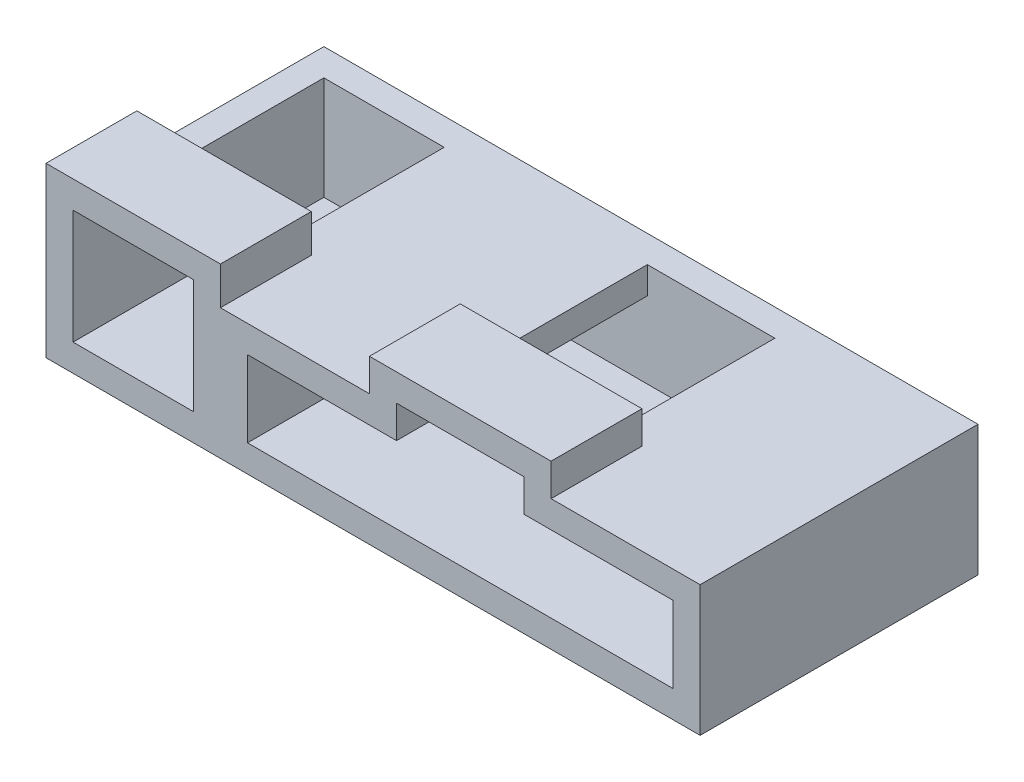
ISO-10303-21;
HEADER;
FILE_DESCRIPTION(('STEP AP214'),'2;1');
FILE_NAME('part.step','',(''),(''),'','','');
FILE_SCHEMA(('AUTOMOTIVE_DESIGN { 1 0 10303 214 1 1 1 1 }'));
ENDSEC;
DATA;
#1=APPLICATION_CONTEXT('core data for automotive mechanical design processes');
#2=APPLICATION_PROTOCOL_DEFINITION('international standard','automotive_design',2000,#1);
#3=PRODUCT_CONTEXT('',#1,'mechanical');
#4=PRODUCT('Part','Part','',(#3));
#5=PRODUCT_RELATED_PRODUCT_CATEGORY('part','',(#4));
#6=PRODUCT_DEFINITION_FORMATION('','',#4);
#7=PRODUCT_DEFINITION_CONTEXT('part definition',#1,'design');
#8=PRODUCT_DEFINITION('design','',#6,#7);
#9=PRODUCT_DEFINITION_SHAPE('','',#8);
#10=(LENGTH_UNIT() NAMED_UNIT(*) SI_UNIT(.MILLI.,.METRE.));
#11=(NAMED_UNIT(*) PLANE_ANGLE_UNIT() SI_UNIT($,.RADIAN.));
#12=(NAMED_UNIT(*) SI_UNIT($,.STERADIAN.) SOLID_ANGLE_UNIT());
#13=UNCERTAINTY_MEASURE_WITH_UNIT(LENGTH_MEASURE(1.E-05),#10,'distance_accuracy_value','');
#14=(GEOMETRIC_REPRESENTATION_CONTEXT(3) GLOBAL_UNCERTAINTY_ASSIGNED_CONTEXT((#13)) GLOBAL_UNIT_ASSIGNED_CONTEXT((#10,
#11,#12)) REPRESENTATION_CONTEXT('',''));
#15=CARTESIAN_POINT('',(0.,0.,0.));
#16=DIRECTION('',(0.,0.,1.));
#17=DIRECTION('',(1.,0.,0.));
#18=AXIS2_PLACEMENT_3D('',#15,#16,#17);
#19=CARTESIAN_POINT('',(-43.6494661724568,7.112,-32.0176029341922));
#20=DIRECTION('',(0.,0.,1.));
#21=DIRECTION('',(1.,0.,0.));
#22=AXIS2_PLACEMENT_3D('',#19,#20,#21);
#23=PLANE('',#22);
#24=DIRECTION('',(0.,-1.,0.));
#25=VECTOR('',#24,1.);
#26=CARTESIAN_POINT('',(-43.6494661724568,7.112,-32.0176029341922));
#27=LINE('',#26,#25);
#28=CARTESIAN_POINT('',(-43.6494661724568,5.5118,-32.0176029341922));
#29=VERTEX_POINT('',#28);
#30=CARTESIAN_POINT('',(-43.6494661724568,0.,-32.0176029341922));
#31=VERTEX_POINT('',#30);
#32=EDGE_CURVE('E241',#29,#31,#27,.T.);
#33=ORIENTED_EDGE('',*,*,#32,.F.);
#34=DIRECTION('',(-1.,0.,0.));
#35=VECTOR('',#34,1.);
#36=CARTESIAN_POINT('',(-43.6494661724568,5.5118,-32.0176029341922));
#37=LINE('',#36,#35);
#38=CARTESIAN_POINT('',(-16.0269661724568,5.5118,-32.0176029341922));
#39=VERTEX_POINT('',#38);
#40=EDGE_CURVE('E264',#39,#29,#37,.T.);
#41=ORIENTED_EDGE('',*,*,#40,.F.);
#42=DIRECTION('',(0.,-1.,0.));
#43=VECTOR('',#42,1.);
#44=CARTESIAN_POINT('',(-16.0269661724568,7.112,-32.0176029341922));
#45=LINE('',#44,#43);
#46=CARTESIAN_POINT('',(-16.0269661724568,0.,-32.0176029341922));
#47=VERTEX_POINT('',#46);
#48=EDGE_CURVE('E258',#39,#47,#45,.T.);
#49=ORIENTED_EDGE('',*,*,#48,.T.);
#50=DIRECTION('',(-1.,0.,0.));
#51=VECTOR('',#50,1.);
#52=CARTESIAN_POINT('',(-43.6494661724568,0.,-32.0176029341922));
#53=LINE('',#52,#51);
#54=EDGE_CURVE('E239',#47,#31,#53,.T.);
#55=ORIENTED_EDGE('',*,*,#54,.T.);
#56=EDGE_LOOP('',(#33,#41,#49,#55));
#57=FACE_BOUND('',#56,.T.);
#58=ADVANCED_FACE('F34',(#57),#23,.F.);
#59=CARTESIAN_POINT('',(-43.6494661724568,7.112,-30.8746029341922));
#60=DIRECTION('',(0.,0.,1.));
#61=DIRECTION('',(1.,0.,0.));
#62=AXIS2_PLACEMENT_3D('',#59,#60,#61);
#63=PLANE('',#62);
#64=DIRECTION('',(0.,-1.,0.));
#65=VECTOR('',#64,1.);
#66=CARTESIAN_POINT('',(-37.4264661724568,5.969,-30.8746029341922));
#67=LINE('',#66,#65);
#68=CARTESIAN_POINT('',(-37.4264661724568,5.5118,-30.8746029341922));
#69=VERTEX_POINT('',#68);
#70=CARTESIAN_POINT('',(-37.4264661724568,1.143,-30.8746029341922));
#71=VERTEX_POINT('',#70);
#72=EDGE_CURVE('E334',#69,#71,#67,.T.);
#73=ORIENTED_EDGE('',*,*,#72,.F.);
#74=DIRECTION('',(-1.,0.,0.));
#75=VECTOR('',#74,1.);
#76=CARTESIAN_POINT('',(-43.6494661724568,5.5118,-30.8746029341922));
#77=LINE('',#76,#75);
#78=CARTESIAN_POINT('',(-42.5064661724568,5.5118,-30.8746029341922));
#79=VERTEX_POINT('',#78);
#80=EDGE_CURVE('E436',#69,#79,#77,.T.);
#81=ORIENTED_EDGE('',*,*,#80,.T.);
#82=DIRECTION('',(0.,1.,0.));
#83=VECTOR('',#82,1.);
#84=CARTESIAN_POINT('',(-42.5064661724568,1.143,-30.8746029341922));
#85=LINE('',#84,#83);
#86=CARTESIAN_POINT('',(-42.5064661724568,1.143,-30.8746029341922));
#87=VERTEX_POINT('',#86);
#88=EDGE_CURVE('E336',#87,#79,#85,.T.);
#89=ORIENTED_EDGE('',*,*,#88,.F.);
#90=DIRECTION('',(-1.,0.,0.));
#91=VECTOR('',#90,1.);
#92=CARTESIAN_POINT('',(-37.4264661724568,1.143,-30.8746029341922));
#93=LINE('',#92,#91);
#94=EDGE_CURVE('E340',#71,#87,#93,.T.);
#95=ORIENTED_EDGE('',*,*,#94,.F.);
#96=EDGE_LOOP('',(#73,#81,#89,#95));
#97=FACE_BOUND('',#96,.T.);
#98=ADVANCED_FACE('F503',(#97),#63,.T.);
#99=CARTESIAN_POINT('',(-43.6494661724568,7.112,-30.8746029341922));
#100=DIRECTION('',(0.,0.,1.));
#101=DIRECTION('',(1.,0.,0.));
#102=AXIS2_PLACEMENT_3D('',#99,#100,#101);
#103=PLANE('',#102);
#104=DIRECTION('',(0.,-1.,0.));
#105=VECTOR('',#104,1.);
#106=CARTESIAN_POINT('',(-23.4628161724568,4.3688,-30.8746029341922));
#107=LINE('',#106,#105);
#108=CARTESIAN_POINT('',(-23.4628161724568,5.5118,-30.8746029341922));
#109=VERTEX_POINT('',#108);
#110=CARTESIAN_POINT('',(-23.4628161724568,4.3688,-30.8746029341922));
#111=VERTEX_POINT('',#110);
#112=EDGE_CURVE('E275',#109,#111,#107,.T.);
#113=ORIENTED_EDGE('',*,*,#112,.F.);
#114=DIRECTION('',(-1.,0.,0.));
#115=VECTOR('',#114,1.);
#116=CARTESIAN_POINT('',(-43.6494661724568,5.5118,-30.8746029341922));
#117=LINE('',#116,#115);
#118=CARTESIAN_POINT('',(-28.8476161724568,5.5118,-30.8746029341922));
#119=VERTEX_POINT('',#118);
#120=EDGE_CURVE('E42',#109,#119,#117,.T.);
#121=ORIENTED_EDGE('',*,*,#120,.T.);
#122=DIRECTION('',(0.,1.,0.));
#123=VECTOR('',#122,1.);
#124=CARTESIAN_POINT('',(-28.8476161724568,5.7404,-30.8746029341922));
#125=LINE('',#124,#123);
#126=CARTESIAN_POINT('',(-28.8476161724568,4.3688,-30.8746029341922));
#127=VERTEX_POINT('',#126);
#128=EDGE_CURVE('E272',#127,#119,#125,.T.);
#129=ORIENTED_EDGE('',*,*,#128,.F.);
#130=DIRECTION('',(1.,0.,0.));
#131=VECTOR('',#130,1.);
#132=CARTESIAN_POINT('',(-28.8476161724568,4.3688,-30.8746029341922));
#133=LINE('',#132,#131);
#134=CARTESIAN_POINT('',(-35.1404661724568,4.3688,-30.8746029341922));
#135=VERTEX_POINT('',#134);
#136=EDGE_CURVE('E284',#135,#127,#133,.T.);
#137=ORIENTED_EDGE('',*,*,#136,.F.);
#138=DIRECTION('',(0.,1.,0.));
#139=VECTOR('',#138,1.);
#140=CARTESIAN_POINT('',(-35.1404661724568,4.3688,-30.8746029341922));
#141=LINE('',#140,#139);
#142=CARTESIAN_POINT('',(-35.1404661724568,1.143,-30.8746029341922));
#143=VERTEX_POINT('',#142);
#144=EDGE_CURVE('E286',#143,#135,#141,.T.);
#145=ORIENTED_EDGE('',*,*,#144,.F.);
#146=DIRECTION('',(-1.,0.,0.));
#147=VECTOR('',#146,1.);
#148=CARTESIAN_POINT('',(-35.1404661724568,1.143,-30.8746029341922));
#149=LINE('',#148,#147);
#150=CARTESIAN_POINT('',(-17.1699661724568,1.143,-30.8746029341922));
#151=VERTEX_POINT('',#150);
#152=EDGE_CURVE('E317',#151,#143,#149,.T.);
#153=ORIENTED_EDGE('',*,*,#152,.F.);
#154=DIRECTION('',(0.,-1.,0.));
#155=VECTOR('',#154,1.);
#156=CARTESIAN_POINT('',(-17.1699661724568,1.143,-30.8746029341922));
#157=LINE('',#156,#155);
#158=CARTESIAN_POINT('',(-17.1699661724568,4.3688,-30.8746029341922));
#159=VERTEX_POINT('',#158);
#160=EDGE_CURVE('E410',#159,#151,#157,.T.);
#161=ORIENTED_EDGE('',*,*,#160,.F.);
#162=DIRECTION('',(1.,0.,0.));
#163=VECTOR('',#162,1.);
#164=CARTESIAN_POINT('',(-17.1699661724568,4.3688,-30.8746029341922));
#165=LINE('',#164,#163);
#166=EDGE_CURVE('E288',#111,#159,#165,.T.);
#167=ORIENTED_EDGE('',*,*,#166,.F.);
#168=EDGE_LOOP('',(#113,#121,#129,#137,#145,#153,#161,#167));
#169=FACE_BOUND('',#168,.T.);
#170=ADVANCED_FACE('F270',(#169),#103,.T.);
#171=CARTESIAN_POINT('',(-43.6494661724568,7.112,-20.2828029341922));
#172=DIRECTION('',(0.,0.,-1.));
#173=DIRECTION('',(-1.,0.,0.));
#174=AXIS2_PLACEMENT_3D('',#171,#172,#173);
#175=PLANE('',#174);
#176=DIRECTION('',(0.,-1.,0.));
#177=VECTOR('',#176,1.);
#178=CARTESIAN_POINT('',(-35.1404661724568,4.3688,-20.2828029341922));
#179=LINE('',#178,#177);
#180=CARTESIAN_POINT('',(-35.1404661724568,4.3688,-20.2828029341922));
#181=VERTEX_POINT('',#180);
#182=CARTESIAN_POINT('',(-35.1404661724568,1.143,-20.2828029341922));
#183=VERTEX_POINT('',#182);
#184=EDGE_CURVE('E294',#181,#183,#179,.T.);
#185=ORIENTED_EDGE('',*,*,#184,.F.);
#186=DIRECTION('',(-1.,0.,0.));
#187=VECTOR('',#186,1.);
#188=CARTESIAN_POINT('',(-28.8476161724568,4.3688,-20.2828029341922));
#189=LINE('',#188,#187);
#190=CARTESIAN_POINT('',(-28.8476161724568,4.3688,-20.2828029341922));
#191=VERTEX_POINT('',#190);
#192=EDGE_CURVE('E292',#191,#181,#189,.T.);
#193=ORIENTED_EDGE('',*,*,#192,.F.);
#194=DIRECTION('',(0.,-1.,0.));
#195=VECTOR('',#194,1.);
#196=CARTESIAN_POINT('',(-28.8476161724568,5.7404,-20.2828029341922));
#197=LINE('',#196,#195);
#198=CARTESIAN_POINT('',(-28.8476161724568,5.7404,-20.2828029341922));
#199=VERTEX_POINT('',#198);
#200=EDGE_CURVE('E313',#199,#191,#197,.T.);
#201=ORIENTED_EDGE('',*,*,#200,.F.);
#202=DIRECTION('',(-1.,0.,0.));
#203=VECTOR('',#202,1.);
#204=CARTESIAN_POINT('',(-23.4628161724568,5.7404,-20.2828029341922));
#205=LINE('',#204,#203);
#206=CARTESIAN_POINT('',(-23.4628161724568,5.7404,-20.2828029341922));
#207=VERTEX_POINT('',#206);
#208=EDGE_CURVE('E310',#207,#199,#205,.T.);
#209=ORIENTED_EDGE('',*,*,#208,.F.);
#210=DIRECTION('',(0.,1.,0.));
#211=VECTOR('',#210,1.);
#212=CARTESIAN_POINT('',(-23.4628161724568,4.3688,-20.2828029341922));
#213=LINE('',#212,#211);
#214=CARTESIAN_POINT('',(-23.4628161724568,4.3688,-20.2828029341922));
#215=VERTEX_POINT('',#214);
#216=EDGE_CURVE('E307',#215,#207,#213,.T.);
#217=ORIENTED_EDGE('',*,*,#216,.F.);
#218=DIRECTION('',(-1.,0.,0.));
#219=VECTOR('',#218,1.);
#220=CARTESIAN_POINT('',(-17.1699661724568,4.3688,-20.2828029341922));
#221=LINE('',#220,#219);
#222=CARTESIAN_POINT('',(-17.1699661724568,4.3688,-20.2828029341922));
#223=VERTEX_POINT('',#222);
#224=EDGE_CURVE('E304',#223,#215,#221,.T.);
#225=ORIENTED_EDGE('',*,*,#224,.F.);
#226=DIRECTION('',(0.,1.,0.));
#227=VECTOR('',#226,1.);
#228=CARTESIAN_POINT('',(-17.1699661724568,1.143,-20.2828029341922));
#229=LINE('',#228,#227);
#230=CARTESIAN_POINT('',(-17.1699661724568,1.143,-20.2828029341922));
#231=VERTEX_POINT('',#230);
#232=EDGE_CURVE('E301',#231,#223,#229,.T.);
#233=ORIENTED_EDGE('',*,*,#232,.F.);
#234=DIRECTION('',(1.,0.,0.));
#235=VECTOR('',#234,1.);
#236=CARTESIAN_POINT('',(-35.1404661724568,1.143,-20.2828029341922));
#237=LINE('',#236,#235);
#238=EDGE_CURVE('E298',#183,#231,#237,.T.);
#239=ORIENTED_EDGE('',*,*,#238,.F.);
#240=EDGE_LOOP('',(#185,#193,#201,#209,#217,#225,#233,#239));
#241=FACE_BOUND('',#240,.T.);
#242=DIRECTION('',(1.,0.,0.));
#243=VECTOR('',#242,1.);
#244=CARTESIAN_POINT('',(-37.4264661724568,1.143,-20.2828029341922));
#245=LINE('',#244,#243);
#246=CARTESIAN_POINT('',(-42.5064661724568,1.143,-20.2828029341922));
#247=VERTEX_POINT('',#246);
#248=CARTESIAN_POINT('',(-37.4264661724568,1.143,-20.2828029341922));
#249=VERTEX_POINT('',#248);
#250=EDGE_CURVE('E342',#247,#249,#245,.T.);
#251=ORIENTED_EDGE('',*,*,#250,.F.);
#252=DIRECTION('',(0.,-1.,0.));
#253=VECTOR('',#252,1.);
#254=CARTESIAN_POINT('',(-42.5064661724568,1.143,-20.2828029341922));
#255=LINE('',#254,#253);
#256=CARTESIAN_POINT('',(-42.5064661724568,5.969,-20.2828029341922));
#257=VERTEX_POINT('',#256);
#258=EDGE_CURVE('E333',#257,#247,#255,.T.);
#259=ORIENTED_EDGE('',*,*,#258,.F.);
#260=DIRECTION('',(-1.,0.,0.));
#261=VECTOR('',#260,1.);
#262=CARTESIAN_POINT('',(-42.5064661724568,5.969,-20.2828029341922));
#263=LINE('',#262,#261);
#264=CARTESIAN_POINT('',(-37.4264661724568,5.969,-20.2828029341922));
#265=VERTEX_POINT('',#264);
#266=EDGE_CURVE('E348',#265,#257,#263,.T.);
#267=ORIENTED_EDGE('',*,*,#266,.F.);
#268=DIRECTION('',(0.,1.,0.));
#269=VECTOR('',#268,1.);
#270=CARTESIAN_POINT('',(-37.4264661724568,5.969,-20.2828029341922));
#271=LINE('',#270,#269);
#272=EDGE_CURVE('E345',#249,#265,#271,.T.);
#273=ORIENTED_EDGE('',*,*,#272,.F.);
#274=EDGE_LOOP('',(#251,#259,#267,#273));
#275=FACE_BOUND('',#274,.T.);
#276=DIRECTION('',(0.,-1.,0.));
#277=VECTOR('',#276,1.);
#278=CARTESIAN_POINT('',(-36.2834661724568,7.112,-20.2828029341922));
#279=LINE('',#278,#277);
#280=CARTESIAN_POINT('',(-36.2834661724568,7.112,-20.2828029341922));
#281=VERTEX_POINT('',#280);
#282=CARTESIAN_POINT('',(-36.2834661724568,5.5118,-20.2828029341922));
#283=VERTEX_POINT('',#282);
#284=EDGE_CURVE('E378',#281,#283,#279,.T.);
#285=ORIENTED_EDGE('',*,*,#284,.F.);
#286=DIRECTION('',(1.,0.,0.));
#287=VECTOR('',#286,1.);
#288=CARTESIAN_POINT('',(-43.6494661724568,7.112,-20.2828029341922));
#289=LINE('',#288,#287);
#290=CARTESIAN_POINT('',(-43.6494661724568,7.112,-20.2828029341922));
#291=VERTEX_POINT('',#290);
#292=EDGE_CURVE('E238',#291,#281,#289,.T.);
#293=ORIENTED_EDGE('',*,*,#292,.F.);
#294=DIRECTION('',(0.,-1.,0.));
#295=VECTOR('',#294,1.);
#296=CARTESIAN_POINT('',(-43.6494661724568,7.112,-20.2828029341922));
#297=LINE('',#296,#295);
#298=CARTESIAN_POINT('',(-43.6494661724568,0.,-20.2828029341922));
#299=VERTEX_POINT('',#298);
#300=EDGE_CURVE('E237',#291,#299,#297,.T.);
#301=ORIENTED_EDGE('',*,*,#300,.T.);
#302=DIRECTION('',(1.,0.,0.));
#303=VECTOR('',#302,1.);
#304=CARTESIAN_POINT('',(-43.6494661724568,0.,-20.2828029341922));
#305=LINE('',#304,#303);
#306=CARTESIAN_POINT('',(-16.0269661724568,0.,-20.2828029341922));
#307=VERTEX_POINT('',#306);
#308=EDGE_CURVE('E252',#299,#307,#305,.T.);
#309=ORIENTED_EDGE('',*,*,#308,.T.);
#310=DIRECTION('',(0.,-1.,0.));
#311=VECTOR('',#310,1.);
#312=CARTESIAN_POINT('',(-16.0269661724568,7.112,-20.2828029341922));
#313=LINE('',#312,#311);
#314=CARTESIAN_POINT('',(-16.0269661724568,5.5118,-20.2828029341922));
#315=VERTEX_POINT('',#314);
#316=EDGE_CURVE('E260',#315,#307,#313,.T.);
#317=ORIENTED_EDGE('',*,*,#316,.F.);
#318=DIRECTION('',(1.,0.,0.));
#319=VECTOR('',#318,1.);
#320=CARTESIAN_POINT('',(-43.6494661724568,5.5118,-20.2828029341922));
#321=LINE('',#320,#319);
#322=CARTESIAN_POINT('',(-22.3198161724568,5.5118,-20.2828029341922));
#323=VERTEX_POINT('',#322);
#324=EDGE_CURVE('E381',#323,#315,#321,.T.);
#325=ORIENTED_EDGE('',*,*,#324,.F.);
#326=DIRECTION('',(0.,-1.,0.));
#327=VECTOR('',#326,1.);
#328=CARTESIAN_POINT('',(-22.3198161724568,7.112,-20.2828029341922));
#329=LINE('',#328,#327);
#330=CARTESIAN_POINT('',(-22.3198161724568,6.8834,-20.2828029341922));
#331=VERTEX_POINT('',#330);
#332=EDGE_CURVE('E384',#331,#323,#329,.T.);
#333=ORIENTED_EDGE('',*,*,#332,.F.);
#334=DIRECTION('',(1.,0.,0.));
#335=VECTOR('',#334,1.);
#336=CARTESIAN_POINT('',(-43.6494661724568,6.8834,-20.2828029341922));
#337=LINE('',#336,#335);
#338=CARTESIAN_POINT('',(-29.9906161724568,6.8834,-20.2828029341922));
#339=VERTEX_POINT('',#338);
#340=EDGE_CURVE('E387',#339,#331,#337,.T.);
#341=ORIENTED_EDGE('',*,*,#340,.F.);
#342=DIRECTION('',(0.,1.,0.));
#343=VECTOR('',#342,1.);
#344=CARTESIAN_POINT('',(-29.9906161724568,7.112,-20.2828029341922));
#345=LINE('',#344,#343);
#346=CARTESIAN_POINT('',(-29.9906161724568,5.5118,-20.2828029341922));
#347=VERTEX_POINT('',#346);
#348=EDGE_CURVE('E389',#347,#339,#345,.T.);
#349=ORIENTED_EDGE('',*,*,#348,.F.);
#350=DIRECTION('',(1.,0.,0.));
#351=VECTOR('',#350,1.);
#352=CARTESIAN_POINT('',(-43.6494661724568,5.5118,-20.2828029341922));
#353=LINE('',#352,#351);
#354=EDGE_CURVE('E247',#283,#347,#353,.T.);
#355=ORIENTED_EDGE('',*,*,#354,.F.);
#356=EDGE_LOOP('',(#285,#293,#301,#309,#317,#325,#333,#341,#349,#355));
#357=FACE_BOUND('',#356,.T.);
#358=ADVANCED_FACE('F427',(#241,#275,#357),#175,.F.);
#359=CARTESIAN_POINT('',(-16.0269661724568,7.112,-20.2828029341922));
#360=DIRECTION('',(-1.,0.,0.));
#361=DIRECTION('',(0.,0.,1.));
#362=AXIS2_PLACEMENT_3D('',#359,#360,#361);
#363=PLANE('',#362);
#364=DIRECTION('',(0.,0.,-1.));
#365=VECTOR('',#364,1.);
#366=CARTESIAN_POINT('',(-16.0269661724568,5.5118,18.2709051658806));
#367=LINE('',#366,#365);
#368=EDGE_CURVE('E361',#315,#39,#367,.T.);
#369=ORIENTED_EDGE('',*,*,#368,.F.);
#370=ORIENTED_EDGE('',*,*,#316,.T.);
#371=DIRECTION('',(0.,0.,-1.));
#372=VECTOR('',#371,1.);
#373=CARTESIAN_POINT('',(-16.0269661724568,0.,-20.2828029341922));
#374=LINE('',#373,#372);
#375=EDGE_CURVE('E244',#307,#47,#374,.T.);
#376=ORIENTED_EDGE('',*,*,#375,.T.);
#377=ORIENTED_EDGE('',*,*,#48,.F.);
#378=EDGE_LOOP('',(#369,#370,#376,#377));
#379=FACE_BOUND('',#378,.T.);
#380=ADVANCED_FACE('F471',(#379),#363,.F.);
#381=CARTESIAN_POINT('',(-43.6494661724568,7.112,-32.0176029341922));
#382=DIRECTION('',(0.,-1.,0.));
#383=DIRECTION('',(0.,0.,-1.));
#384=AXIS2_PLACEMENT_3D('',#381,#382,#383);
#385=PLANE('',#384);
#386=DIRECTION('',(0.,0.,1.));
#387=VECTOR('',#386,1.);
#388=CARTESIAN_POINT('',(-36.2834661724568,7.112,-32.0176029341922));
#389=LINE('',#388,#387);
#390=CARTESIAN_POINT('',(-36.2834661724568,7.112,-24.1182029341922));
#391=VERTEX_POINT('',#390);
#392=EDGE_CURVE('E232',#391,#281,#389,.T.);
#393=ORIENTED_EDGE('',*,*,#392,.F.);
#394=DIRECTION('',(1.,0.,0.));
#395=VECTOR('',#394,1.);
#396=CARTESIAN_POINT('',(-43.6494661724568,7.112,-24.1182029341922));
#397=LINE('',#396,#395);
#398=CARTESIAN_POINT('',(-43.6494661724568,7.112,-24.1182029341922));
#399=VERTEX_POINT('',#398);
#400=EDGE_CURVE('E216',#399,#391,#397,.T.);
#401=ORIENTED_EDGE('',*,*,#400,.F.);
#402=DIRECTION('',(0.,0.,1.));
#403=VECTOR('',#402,1.);
#404=CARTESIAN_POINT('',(-43.6494661724568,7.112,-20.2828029341922));
#405=LINE('',#404,#403);
#406=EDGE_CURVE('E230',#399,#291,#405,.T.);
#407=ORIENTED_EDGE('',*,*,#406,.T.);
#408=ORIENTED_EDGE('',*,*,#292,.T.);
#409=EDGE_LOOP('',(#393,#401,#407,#408));
#410=FACE_BOUND('',#409,.T.);
#411=ADVANCED_FACE('F228',(#410),#385,.F.);
#412=CARTESIAN_POINT('',(-43.6494661724568,7.112,-20.2828029341922));
#413=DIRECTION('',(1.,0.,0.));
#414=DIRECTION('',(0.,0.,-1.));
#415=AXIS2_PLACEMENT_3D('',#412,#413,#414);
#416=PLANE('',#415);
#417=ORIENTED_EDGE('',*,*,#406,.F.);
#418=DIRECTION('',(0.,1.,0.));
#419=VECTOR('',#418,1.);
#420=CARTESIAN_POINT('',(-43.6494661724568,-17.2336278808401,-24.1182029341922));
#421=LINE('',#420,#419);
#422=CARTESIAN_POINT('',(-43.6494661724568,5.5118,-24.1182029341922));
#423=VERTEX_POINT('',#422);
#424=EDGE_CURVE('E213',#423,#399,#421,.T.);
#425=ORIENTED_EDGE('',*,*,#424,.F.);
#426=DIRECTION('',(0.,0.,-1.));
#427=VECTOR('',#426,1.);
#428=CARTESIAN_POINT('',(-43.6494661724568,5.5118,-32.0176029341922));
#429=LINE('',#428,#427);
#430=EDGE_CURVE('E479',#423,#29,#429,.T.);
#431=ORIENTED_EDGE('',*,*,#430,.T.);
#432=ORIENTED_EDGE('',*,*,#32,.T.);
#433=DIRECTION('',(0.,0.,1.));
#434=VECTOR('',#433,1.);
#435=CARTESIAN_POINT('',(-43.6494661724568,0.,-20.2828029341922));
#436=LINE('',#435,#434);
#437=EDGE_CURVE('E250',#31,#299,#436,.T.);
#438=ORIENTED_EDGE('',*,*,#437,.T.);
#439=ORIENTED_EDGE('',*,*,#300,.F.);
#440=EDGE_LOOP('',(#417,#425,#431,#432,#438,#439));
#441=FACE_BOUND('',#440,.T.);
#442=ADVANCED_FACE('F36',(#441),#416,.F.);
#443=CARTESIAN_POINT('',(-43.6494661724568,0.,-32.0176029341922));
#444=DIRECTION('',(0.,-1.,0.));
#445=DIRECTION('',(0.,0.,-1.));
#446=AXIS2_PLACEMENT_3D('',#443,#444,#445);
#447=PLANE('',#446);
#448=ORIENTED_EDGE('',*,*,#437,.F.);
#449=ORIENTED_EDGE('',*,*,#54,.F.);
#450=ORIENTED_EDGE('',*,*,#375,.F.);
#451=ORIENTED_EDGE('',*,*,#308,.F.);
#452=EDGE_LOOP('',(#448,#449,#450,#451));
#453=FACE_BOUND('',#452,.T.);
#454=ADVANCED_FACE('F468',(#453),#447,.T.);
#455=CARTESIAN_POINT('',(-36.2834661724568,5.5118,18.2709051658806));
#456=DIRECTION('',(0.,1.,0.));
#457=DIRECTION('',(0.,0.,1.));
#458=AXIS2_PLACEMENT_3D('',#455,#456,#457);
#459=PLANE('',#458);
#460=DIRECTION('',(0.,0.,-1.));
#461=VECTOR('',#460,1.);
#462=CARTESIAN_POINT('',(-29.9906161724568,5.5118,18.2709051658806));
#463=LINE('',#462,#461);
#464=CARTESIAN_POINT('',(-29.9906161724568,5.5118,-24.1182029341922));
#465=VERTEX_POINT('',#464);
#466=EDGE_CURVE('E372',#347,#465,#463,.T.);
#467=ORIENTED_EDGE('',*,*,#466,.T.);
#468=DIRECTION('',(-1.,0.,0.));
#469=VECTOR('',#468,1.);
#470=CARTESIAN_POINT('',(-43.6494661724568,5.5118,-24.1182029341922));
#471=LINE('',#470,#469);
#472=CARTESIAN_POINT('',(-28.8476161724568,5.5118,-24.1182029341922));
#473=VERTEX_POINT('',#472);
#474=EDGE_CURVE('E438',#473,#465,#471,.T.);
#475=ORIENTED_EDGE('',*,*,#474,.F.);
#476=DIRECTION('',(0.,0.,-1.));
#477=VECTOR('',#476,1.);
#478=CARTESIAN_POINT('',(-28.8476161724568,5.5118,-50.5668605206834));
#479=LINE('',#478,#477);
#480=EDGE_CURVE('E281',#473,#119,#479,.T.);
#481=ORIENTED_EDGE('',*,*,#480,.T.);
#482=ORIENTED_EDGE('',*,*,#120,.F.);
#483=DIRECTION('',(0.,0.,1.));
#484=VECTOR('',#483,1.);
#485=CARTESIAN_POINT('',(-23.4628161724568,5.5118,-50.5668605206834));
#486=LINE('',#485,#484);
#487=CARTESIAN_POINT('',(-23.4628161724568,5.5118,-24.1182029341922));
#488=VERTEX_POINT('',#487);
#489=EDGE_CURVE('E434',#109,#488,#486,.T.);
#490=ORIENTED_EDGE('',*,*,#489,.T.);
#491=CARTESIAN_POINT('',(-22.3198161724568,5.5118,-24.1182029341922));
#492=VERTEX_POINT('',#491);
#493=EDGE_CURVE('E49',#492,#488,#471,.T.);
#494=ORIENTED_EDGE('',*,*,#493,.F.);
#495=DIRECTION('',(0.,0.,-1.));
#496=VECTOR('',#495,1.);
#497=CARTESIAN_POINT('',(-22.3198161724568,5.5118,18.2709051658806));
#498=LINE('',#497,#496);
#499=EDGE_CURVE('E360',#323,#492,#498,.T.);
#500=ORIENTED_EDGE('',*,*,#499,.F.);
#501=ORIENTED_EDGE('',*,*,#324,.T.);
#502=ORIENTED_EDGE('',*,*,#368,.T.);
#503=ORIENTED_EDGE('',*,*,#40,.T.);
#504=ORIENTED_EDGE('',*,*,#430,.F.);
#505=CARTESIAN_POINT('',(-42.5064661724568,5.5118,-24.1182029341922));
#506=VERTEX_POINT('',#505);
#507=EDGE_CURVE('E219',#506,#423,#471,.T.);
#508=ORIENTED_EDGE('',*,*,#507,.F.);
#509=DIRECTION('',(0.,0.,-1.));
#510=VECTOR('',#509,1.);
#511=CARTESIAN_POINT('',(-42.5064661724568,5.5118,-50.5668605206834));
#512=LINE('',#511,#510);
#513=EDGE_CURVE('E445',#506,#79,#512,.T.);
#514=ORIENTED_EDGE('',*,*,#513,.T.);
#515=ORIENTED_EDGE('',*,*,#80,.F.);
#516=DIRECTION('',(0.,0.,1.));
#517=VECTOR('',#516,1.);
#518=CARTESIAN_POINT('',(-37.4264661724568,5.5118,-50.5668605206834));
#519=LINE('',#518,#517);
#520=CARTESIAN_POINT('',(-37.4264661724568,5.5118,-24.1182029341922));
#521=VERTEX_POINT('',#520);
#522=EDGE_CURVE('E443',#69,#521,#519,.T.);
#523=ORIENTED_EDGE('',*,*,#522,.T.);
#524=CARTESIAN_POINT('',(-36.2834661724568,5.5118,-24.1182029341922));
#525=VERTEX_POINT('',#524);
#526=EDGE_CURVE('E56',#525,#521,#471,.T.);
#527=ORIENTED_EDGE('',*,*,#526,.F.);
#528=DIRECTION('',(0.,0.,-1.));
#529=VECTOR('',#528,1.);
#530=CARTESIAN_POINT('',(-36.2834661724568,5.5118,18.2709051658806));
#531=LINE('',#530,#529);
#532=EDGE_CURVE('E375',#283,#525,#531,.T.);
#533=ORIENTED_EDGE('',*,*,#532,.F.);
#534=ORIENTED_EDGE('',*,*,#354,.T.);
#535=EDGE_LOOP('',(#467,#475,#481,#482,#490,#494,#500,#501,#502,#503,#504,#508,#514,#515,#523,
#527,#533,#534));
#536=FACE_BOUND('',#535,.T.);
#537=ADVANCED_FACE('F395',(#536),#459,.T.);
#538=CARTESIAN_POINT('',(-29.9906161724568,5.5118,18.2709051658806));
#539=DIRECTION('',(-1.,0.,0.));
#540=DIRECTION('',(0.,0.,1.));
#541=AXIS2_PLACEMENT_3D('',#538,#539,#540);
#542=PLANE('',#541);
#543=DIRECTION('',(0.,1.,0.));
#544=VECTOR('',#543,1.);
#545=CARTESIAN_POINT('',(-29.9906161724568,5.5118,-24.1182029341922));
#546=LINE('',#545,#544);
#547=CARTESIAN_POINT('',(-29.9906161724568,6.8834,-24.1182029341922));
#548=VERTEX_POINT('',#547);
#549=EDGE_CURVE('E295',#465,#548,#546,.T.);
#550=ORIENTED_EDGE('',*,*,#549,.F.);
#551=ORIENTED_EDGE('',*,*,#466,.F.);
#552=ORIENTED_EDGE('',*,*,#348,.T.);
#553=DIRECTION('',(0.,0.,-1.));
#554=VECTOR('',#553,1.);
#555=CARTESIAN_POINT('',(-29.9906161724568,6.8834,18.2709051658806));
#556=LINE('',#555,#554);
#557=EDGE_CURVE('E369',#339,#548,#556,.T.);
#558=ORIENTED_EDGE('',*,*,#557,.T.);
#559=EDGE_LOOP('',(#550,#551,#552,#558));
#560=FACE_BOUND('',#559,.T.);
#561=ADVANCED_FACE('F400',(#560),#542,.T.);
#562=CARTESIAN_POINT('',(-29.9906161724568,6.8834,18.2709051658806));
#563=DIRECTION('',(0.,1.,0.));
#564=DIRECTION('',(0.,0.,1.));
#565=AXIS2_PLACEMENT_3D('',#562,#563,#564);
#566=PLANE('',#565);
#567=DIRECTION('',(1.,0.,0.));
#568=VECTOR('',#567,1.);
#569=CARTESIAN_POINT('',(-29.9906161724568,6.8834,-24.1182029341922));
#570=LINE('',#569,#568);
#571=CARTESIAN_POINT('',(-22.3198161724568,6.88339999999999,-24.1182029341922));
#572=VERTEX_POINT('',#571);
#573=EDGE_CURVE('E403',#548,#572,#570,.T.);
#574=ORIENTED_EDGE('',*,*,#573,.F.);
#575=ORIENTED_EDGE('',*,*,#557,.F.);
#576=ORIENTED_EDGE('',*,*,#340,.T.);
#577=DIRECTION('',(0.,0.,-1.));
#578=VECTOR('',#577,1.);
#579=CARTESIAN_POINT('',(-22.3198161724568,6.8834,18.2709051658806));
#580=LINE('',#579,#578);
#581=EDGE_CURVE('E364',#331,#572,#580,.T.);
#582=ORIENTED_EDGE('',*,*,#581,.T.);
#583=EDGE_LOOP('',(#574,#575,#576,#582));
#584=FACE_BOUND('',#583,.T.);
#585=ADVANCED_FACE('F477',(#584),#566,.T.);
#586=CARTESIAN_POINT('',(-22.3198161724568,6.8834,18.2709051658806));
#587=DIRECTION('',(1.,0.,0.));
#588=DIRECTION('',(0.,0.,-1.));
#589=AXIS2_PLACEMENT_3D('',#586,#587,#588);
#590=PLANE('',#589);
#591=DIRECTION('',(0.,1.,0.));
#592=VECTOR('',#591,1.);
#593=CARTESIAN_POINT('',(-22.3198161724568,-17.2336278808401,-24.1182029341922));
#594=LINE('',#593,#592);
#595=EDGE_CURVE('E224',#492,#572,#594,.T.);
#596=ORIENTED_EDGE('',*,*,#595,.T.);
#597=ORIENTED_EDGE('',*,*,#581,.F.);
#598=ORIENTED_EDGE('',*,*,#332,.T.);
#599=ORIENTED_EDGE('',*,*,#499,.T.);
#600=EDGE_LOOP('',(#596,#597,#598,#599));
#601=FACE_BOUND('',#600,.T.);
#602=ADVANCED_FACE('F474',(#601),#590,.T.);
#603=CARTESIAN_POINT('',(-36.2834661724568,7.112,18.2709051658806));
#604=DIRECTION('',(1.,0.,0.));
#605=DIRECTION('',(0.,0.,-1.));
#606=AXIS2_PLACEMENT_3D('',#603,#604,#605);
#607=PLANE('',#606);
#608=DIRECTION('',(0.,-1.,0.));
#609=VECTOR('',#608,1.);
#610=CARTESIAN_POINT('',(-36.2834661724568,7.112,-24.1182029341922));
#611=LINE('',#610,#609);
#612=EDGE_CURVE('E405',#391,#525,#611,.T.);
#613=ORIENTED_EDGE('',*,*,#612,.F.);
#614=ORIENTED_EDGE('',*,*,#392,.T.);
#615=ORIENTED_EDGE('',*,*,#284,.T.);
#616=ORIENTED_EDGE('',*,*,#532,.T.);
#617=EDGE_LOOP('',(#613,#614,#615,#616));
#618=FACE_BOUND('',#617,.T.);
#619=ADVANCED_FACE('F461',(#618),#607,.T.);
#620=CARTESIAN_POINT('',(-42.5064661724568,1.143,-50.5668605206834));
#621=DIRECTION('',(-1.,0.,0.));
#622=DIRECTION('',(0.,0.,1.));
#623=AXIS2_PLACEMENT_3D('',#620,#621,#622);
#624=PLANE('',#623);
#625=ORIENTED_EDGE('',*,*,#513,.F.);
#626=DIRECTION('',(0.,1.,0.));
#627=VECTOR('',#626,1.);
#628=CARTESIAN_POINT('',(-42.5064661724568,1.143,-24.1182029341922));
#629=LINE('',#628,#627);
#630=CARTESIAN_POINT('',(-42.5064661724568,5.969,-24.1182029341922));
#631=VERTEX_POINT('',#630);
#632=EDGE_CURVE('E458',#506,#631,#629,.T.);
#633=ORIENTED_EDGE('',*,*,#632,.T.);
#634=DIRECTION('',(0.,0.,1.));
#635=VECTOR('',#634,1.);
#636=CARTESIAN_POINT('',(-42.5064661724568,5.969,-50.5668605206834));
#637=LINE('',#636,#635);
#638=EDGE_CURVE('E337',#631,#257,#637,.T.);
#639=ORIENTED_EDGE('',*,*,#638,.T.);
#640=ORIENTED_EDGE('',*,*,#258,.T.);
#641=DIRECTION('',(0.,0.,1.));
#642=VECTOR('',#641,1.);
#643=CARTESIAN_POINT('',(-42.5064661724568,1.143,-50.5668605206834));
#644=LINE('',#643,#642);
#645=EDGE_CURVE('E351',#87,#247,#644,.T.);
#646=ORIENTED_EDGE('',*,*,#645,.F.);
#647=ORIENTED_EDGE('',*,*,#88,.T.);
#648=EDGE_LOOP('',(#625,#633,#639,#640,#646,#647));
#649=FACE_BOUND('',#648,.T.);
#650=ADVANCED_FACE('F626',(#649),#624,.F.);
#651=CARTESIAN_POINT('',(-42.5064661724568,5.969,-50.5668605206834));
#652=DIRECTION('',(0.,1.,0.));
#653=DIRECTION('',(0.,0.,1.));
#654=AXIS2_PLACEMENT_3D('',#651,#652,#653);
#655=PLANE('',#654);
#656=ORIENTED_EDGE('',*,*,#638,.F.);
#657=DIRECTION('',(1.,0.,0.));
#658=VECTOR('',#657,1.);
#659=CARTESIAN_POINT('',(-42.5064661724568,5.969,-24.1182029341922));
#660=LINE('',#659,#658);
#661=CARTESIAN_POINT('',(-37.4264661724568,5.969,-24.1182029341922));
#662=VERTEX_POINT('',#661);
#663=EDGE_CURVE('E455',#631,#662,#660,.T.);
#664=ORIENTED_EDGE('',*,*,#663,.T.);
#665=DIRECTION('',(0.,0.,1.));
#666=VECTOR('',#665,1.);
#667=CARTESIAN_POINT('',(-37.4264661724568,5.969,-50.5668605206834));
#668=LINE('',#667,#666);
#669=EDGE_CURVE('E353',#662,#265,#668,.T.);
#670=ORIENTED_EDGE('',*,*,#669,.T.);
#671=ORIENTED_EDGE('',*,*,#266,.T.);
#672=EDGE_LOOP('',(#656,#664,#670,#671));
#673=FACE_BOUND('',#672,.T.);
#674=ADVANCED_FACE('F635',(#673),#655,.F.);
#675=CARTESIAN_POINT('',(-37.4264661724568,5.969,-50.5668605206834));
#676=DIRECTION('',(1.,0.,0.));
#677=DIRECTION('',(0.,0.,-1.));
#678=AXIS2_PLACEMENT_3D('',#675,#676,#677);
#679=PLANE('',#678);
#680=ORIENTED_EDGE('',*,*,#669,.F.);
#681=DIRECTION('',(0.,-1.,0.));
#682=VECTOR('',#681,1.);
#683=CARTESIAN_POINT('',(-37.4264661724568,5.969,-24.1182029341922));
#684=LINE('',#683,#682);
#685=EDGE_CURVE('E452',#662,#521,#684,.T.);
#686=ORIENTED_EDGE('',*,*,#685,.T.);
#687=ORIENTED_EDGE('',*,*,#522,.F.);
#688=ORIENTED_EDGE('',*,*,#72,.T.);
#689=DIRECTION('',(0.,0.,1.));
#690=VECTOR('',#689,1.);
#691=CARTESIAN_POINT('',(-37.4264661724568,1.143,-50.5668605206834));
#692=LINE('',#691,#690);
#693=EDGE_CURVE('E355',#71,#249,#692,.T.);
#694=ORIENTED_EDGE('',*,*,#693,.T.);
#695=ORIENTED_EDGE('',*,*,#272,.T.);
#696=EDGE_LOOP('',(#680,#686,#687,#688,#694,#695));
#697=FACE_BOUND('',#696,.T.);
#698=ADVANCED_FACE('F645',(#697),#679,.F.);
#699=CARTESIAN_POINT('',(-37.4264661724568,1.143,-50.5668605206834));
#700=DIRECTION('',(0.,-1.,0.));
#701=DIRECTION('',(0.,0.,-1.));
#702=AXIS2_PLACEMENT_3D('',#699,#700,#701);
#703=PLANE('',#702);
#704=ORIENTED_EDGE('',*,*,#94,.T.);
#705=ORIENTED_EDGE('',*,*,#645,.T.);
#706=ORIENTED_EDGE('',*,*,#250,.T.);
#707=ORIENTED_EDGE('',*,*,#693,.F.);
#708=EDGE_LOOP('',(#704,#705,#706,#707));
#709=FACE_BOUND('',#708,.T.);
#710=ADVANCED_FACE('F655',(#709),#703,.F.);
#711=CARTESIAN_POINT('',(-28.8476161724568,4.3688,-50.5668605206834));
#712=DIRECTION('',(0.,1.,0.));
#713=DIRECTION('',(0.,0.,1.));
#714=AXIS2_PLACEMENT_3D('',#711,#712,#713);
#715=PLANE('',#714);
#716=ORIENTED_EDGE('',*,*,#136,.T.);
#717=DIRECTION('',(0.,0.,1.));
#718=VECTOR('',#717,1.);
#719=CARTESIAN_POINT('',(-28.8476161724568,4.3688,-50.5668605206834));
#720=LINE('',#719,#718);
#721=EDGE_CURVE('E283',#127,#191,#720,.T.);
#722=ORIENTED_EDGE('',*,*,#721,.T.);
#723=ORIENTED_EDGE('',*,*,#192,.T.);
#724=DIRECTION('',(0.,0.,1.));
#725=VECTOR('',#724,1.);
#726=CARTESIAN_POINT('',(-35.1404661724568,4.3688,-50.5668605206834));
#727=LINE('',#726,#725);
#728=EDGE_CURVE('E315',#135,#181,#727,.T.);
#729=ORIENTED_EDGE('',*,*,#728,.F.);
#730=EDGE_LOOP('',(#716,#722,#723,#729));
#731=FACE_BOUND('',#730,.T.);
#732=ADVANCED_FACE('F488',(#731),#715,.F.);
#733=CARTESIAN_POINT('',(-28.8476161724568,5.7404,-50.5668605206834));
#734=DIRECTION('',(-1.,0.,0.));
#735=DIRECTION('',(0.,0.,1.));
#736=AXIS2_PLACEMENT_3D('',#733,#734,#735);
#737=PLANE('',#736);
#738=ORIENTED_EDGE('',*,*,#480,.F.);
#739=DIRECTION('',(0.,1.,0.));
#740=VECTOR('',#739,1.);
#741=CARTESIAN_POINT('',(-28.8476161724568,5.7404,-24.1182029341922));
#742=LINE('',#741,#740);
#743=CARTESIAN_POINT('',(-28.8476161724568,5.7404,-24.1182029341922));
#744=VERTEX_POINT('',#743);
#745=EDGE_CURVE('E450',#473,#744,#742,.T.);
#746=ORIENTED_EDGE('',*,*,#745,.T.);
#747=DIRECTION('',(0.,0.,1.));
#748=VECTOR('',#747,1.);
#749=CARTESIAN_POINT('',(-28.8476161724568,5.7404,-50.5668605206834));
#750=LINE('',#749,#748);
#751=EDGE_CURVE('E318',#744,#199,#750,.T.);
#752=ORIENTED_EDGE('',*,*,#751,.T.);
#753=ORIENTED_EDGE('',*,*,#200,.T.);
#754=ORIENTED_EDGE('',*,*,#721,.F.);
#755=ORIENTED_EDGE('',*,*,#128,.T.);
#756=EDGE_LOOP('',(#738,#746,#752,#753,#754,#755));
#757=FACE_BOUND('',#756,.T.);
#758=ADVANCED_FACE('F279',(#757),#737,.F.);
#759=CARTESIAN_POINT('',(-23.4628161724568,5.7404,-50.5668605206834));
#760=DIRECTION('',(0.,1.,0.));
#761=DIRECTION('',(0.,0.,1.));
#762=AXIS2_PLACEMENT_3D('',#759,#760,#761);
#763=PLANE('',#762);
#764=ORIENTED_EDGE('',*,*,#751,.F.);
#765=DIRECTION('',(1.,0.,0.));
#766=VECTOR('',#765,1.);
#767=CARTESIAN_POINT('',(-23.4628161724568,5.7404,-24.1182029341922));
#768=LINE('',#767,#766);
#769=CARTESIAN_POINT('',(-23.4628161724568,5.7404,-24.1182029341922));
#770=VERTEX_POINT('',#769);
#771=EDGE_CURVE('E447',#744,#770,#768,.T.);
#772=ORIENTED_EDGE('',*,*,#771,.T.);
#773=DIRECTION('',(0.,0.,1.));
#774=VECTOR('',#773,1.);
#775=CARTESIAN_POINT('',(-23.4628161724568,5.7404,-50.5668605206834));
#776=LINE('',#775,#774);
#777=EDGE_CURVE('E320',#770,#207,#776,.T.);
#778=ORIENTED_EDGE('',*,*,#777,.T.);
#779=ORIENTED_EDGE('',*,*,#208,.T.);
#780=EDGE_LOOP('',(#764,#772,#778,#779));
#781=FACE_BOUND('',#780,.T.);
#782=ADVANCED_FACE('F484',(#781),#763,.F.);
#783=CARTESIAN_POINT('',(-23.4628161724568,4.3688,-50.5668605206834));
#784=DIRECTION('',(1.,0.,0.));
#785=DIRECTION('',(0.,0.,-1.));
#786=AXIS2_PLACEMENT_3D('',#783,#784,#785);
#787=PLANE('',#786);
#788=ORIENTED_EDGE('',*,*,#777,.F.);
#789=DIRECTION('',(0.,-1.,0.));
#790=VECTOR('',#789,1.);
#791=CARTESIAN_POINT('',(-23.4628161724568,4.3688,-24.1182029341922));
#792=LINE('',#791,#790);
#793=EDGE_CURVE('E12',#770,#488,#792,.T.);
#794=ORIENTED_EDGE('',*,*,#793,.T.);
#795=ORIENTED_EDGE('',*,*,#489,.F.);
#796=ORIENTED_EDGE('',*,*,#112,.T.);
#797=DIRECTION('',(0.,0.,1.));
#798=VECTOR('',#797,1.);
#799=CARTESIAN_POINT('',(-23.4628161724568,4.3688,-50.5668605206834));
#800=LINE('',#799,#798);
#801=EDGE_CURVE('E322',#111,#215,#800,.T.);
#802=ORIENTED_EDGE('',*,*,#801,.T.);
#803=ORIENTED_EDGE('',*,*,#216,.T.);
#804=EDGE_LOOP('',(#788,#794,#795,#796,#802,#803));
#805=FACE_BOUND('',#804,.T.);
#806=ADVANCED_FACE('F433',(#805),#787,.F.);
#807=CARTESIAN_POINT('',(-17.1699661724568,4.3688,-50.5668605206834));
#808=DIRECTION('',(0.,1.,0.));
#809=DIRECTION('',(0.,0.,1.));
#810=AXIS2_PLACEMENT_3D('',#807,#808,#809);
#811=PLANE('',#810);
#812=ORIENTED_EDGE('',*,*,#166,.T.);
#813=DIRECTION('',(0.,0.,1.));
#814=VECTOR('',#813,1.);
#815=CARTESIAN_POINT('',(-17.1699661724568,4.3688,-50.5668605206834));
#816=LINE('',#815,#814);
#817=EDGE_CURVE('E324',#159,#223,#816,.T.);
#818=ORIENTED_EDGE('',*,*,#817,.T.);
#819=ORIENTED_EDGE('',*,*,#224,.T.);
#820=ORIENTED_EDGE('',*,*,#801,.F.);
#821=EDGE_LOOP('',(#812,#818,#819,#820));
#822=FACE_BOUND('',#821,.T.);
#823=ADVANCED_FACE('F414',(#822),#811,.F.);
#824=CARTESIAN_POINT('',(-17.1699661724568,1.143,-50.5668605206834));
#825=DIRECTION('',(1.,0.,0.));
#826=DIRECTION('',(0.,0.,-1.));
#827=AXIS2_PLACEMENT_3D('',#824,#825,#826);
#828=PLANE('',#827);
#829=ORIENTED_EDGE('',*,*,#160,.T.);
#830=DIRECTION('',(0.,0.,1.));
#831=VECTOR('',#830,1.);
#832=CARTESIAN_POINT('',(-17.1699661724568,1.143,-50.5668605206834));
#833=LINE('',#832,#831);
#834=EDGE_CURVE('E326',#151,#231,#833,.T.);
#835=ORIENTED_EDGE('',*,*,#834,.T.);
#836=ORIENTED_EDGE('',*,*,#232,.T.);
#837=ORIENTED_EDGE('',*,*,#817,.F.);
#838=EDGE_LOOP('',(#829,#835,#836,#837));
#839=FACE_BOUND('',#838,.T.);
#840=ADVANCED_FACE('F420',(#839),#828,.F.);
#841=CARTESIAN_POINT('',(-35.1404661724568,1.143,-50.5668605206834));
#842=DIRECTION('',(0.,-1.,0.));
#843=DIRECTION('',(0.,0.,-1.));
#844=AXIS2_PLACEMENT_3D('',#841,#842,#843);
#845=PLANE('',#844);
#846=ORIENTED_EDGE('',*,*,#152,.T.);
#847=DIRECTION('',(0.,0.,1.));
#848=VECTOR('',#847,1.);
#849=CARTESIAN_POINT('',(-35.1404661724568,1.143,-50.5668605206834));
#850=LINE('',#849,#848);
#851=EDGE_CURVE('E328',#143,#183,#850,.T.);
#852=ORIENTED_EDGE('',*,*,#851,.T.);
#853=ORIENTED_EDGE('',*,*,#238,.T.);
#854=ORIENTED_EDGE('',*,*,#834,.F.);
#855=EDGE_LOOP('',(#846,#852,#853,#854));
#856=FACE_BOUND('',#855,.T.);
#857=ADVANCED_FACE('F493',(#856),#845,.F.);
#858=CARTESIAN_POINT('',(-35.1404661724568,4.3688,-50.5668605206834));
#859=DIRECTION('',(-1.,0.,0.));
#860=DIRECTION('',(0.,0.,1.));
#861=AXIS2_PLACEMENT_3D('',#858,#859,#860);
#862=PLANE('',#861);
#863=ORIENTED_EDGE('',*,*,#144,.T.);
#864=ORIENTED_EDGE('',*,*,#728,.T.);
#865=ORIENTED_EDGE('',*,*,#184,.T.);
#866=ORIENTED_EDGE('',*,*,#851,.F.);
#867=EDGE_LOOP('',(#863,#864,#865,#866));
#868=FACE_BOUND('',#867,.T.);
#869=ADVANCED_FACE('F490',(#868),#862,.F.);
#870=CARTESIAN_POINT('',(-43.6494661724568,-17.2336278808401,-24.1182029341922));
#871=DIRECTION('',(0.,0.,1.));
#872=DIRECTION('',(1.,0.,0.));
#873=AXIS2_PLACEMENT_3D('',#870,#871,#872);
#874=PLANE('',#873);
#875=ORIENTED_EDGE('',*,*,#549,.T.);
#876=ORIENTED_EDGE('',*,*,#573,.T.);
#877=ORIENTED_EDGE('',*,*,#595,.F.);
#878=ORIENTED_EDGE('',*,*,#493,.T.);
#879=ORIENTED_EDGE('',*,*,#793,.F.);
#880=ORIENTED_EDGE('',*,*,#771,.F.);
#881=ORIENTED_EDGE('',*,*,#745,.F.);
#882=ORIENTED_EDGE('',*,*,#474,.T.);
#883=EDGE_LOOP('',(#875,#876,#877,#878,#879,#880,#881,#882));
#884=FACE_BOUND('',#883,.T.);
#885=ADVANCED_FACE('F478',(#884),#874,.F.);
#886=ORIENTED_EDGE('',*,*,#612,.T.);
#887=ORIENTED_EDGE('',*,*,#526,.T.);
#888=ORIENTED_EDGE('',*,*,#685,.F.);
#889=ORIENTED_EDGE('',*,*,#663,.F.);
#890=ORIENTED_EDGE('',*,*,#632,.F.);
#891=ORIENTED_EDGE('',*,*,#507,.T.);
#892=ORIENTED_EDGE('',*,*,#424,.T.);
#893=ORIENTED_EDGE('',*,*,#400,.T.);
#894=EDGE_LOOP('',(#886,#887,#888,#889,#890,#891,#892,#893));
#895=FACE_BOUND('',#894,.T.);
#896=ADVANCED_FACE('F215',(#895),#874,.F.);
#897=CLOSED_SHELL('',(#58,#98,#170,#358,#380,#411,#442,#454,#537,#561,#585,#602,#619,#650,#674,
#698,#710,#732,#758,#782,#806,#823,#840,#857,#869,#885,#896));
#898=MANIFOLD_SOLID_BREP('B2',#897);
#899=ADVANCED_BREP_SHAPE_REPRESENTATION('',(#18,#898),#14);
#900=SHAPE_DEFINITION_REPRESENTATION(#9,#899);
ENDSEC;
END-ISO-10303-21;
